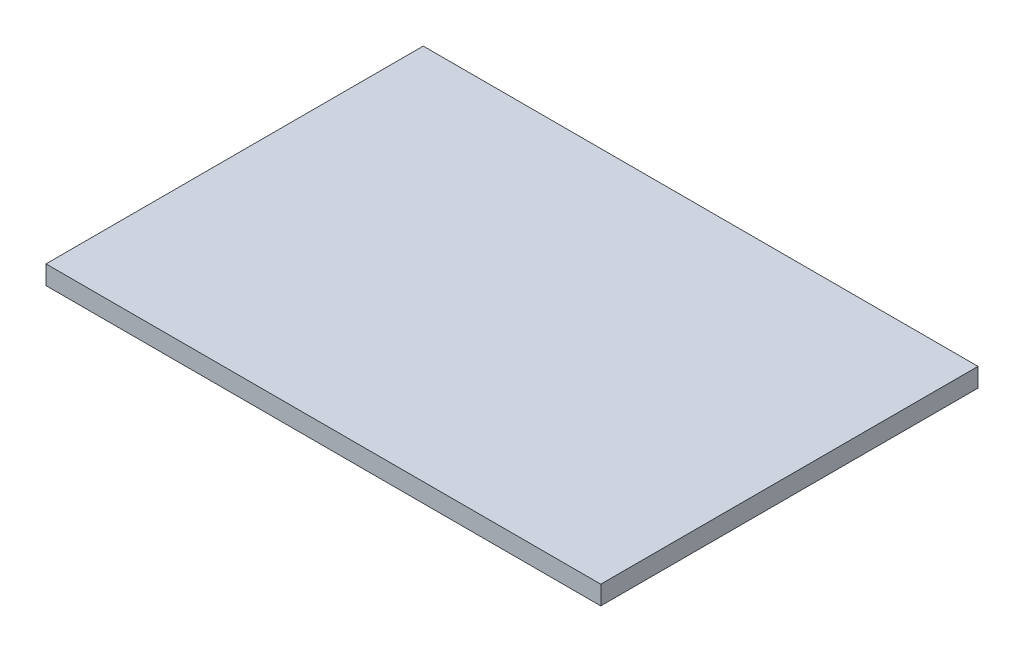
ISO-10303-21;
HEADER;
FILE_DESCRIPTION(('STEP AP214'),'2;1');
FILE_NAME('part.step','',(''),(''),'','','');
FILE_SCHEMA(('AUTOMOTIVE_DESIGN { 1 0 10303 214 1 1 1 1 }'));
ENDSEC;
DATA;
#1=APPLICATION_CONTEXT('core data for automotive mechanical design processes');
#2=APPLICATION_PROTOCOL_DEFINITION('international standard','automotive_design',2000,#1);
#3=PRODUCT_CONTEXT('',#1,'mechanical');
#4=PRODUCT('Part','Part','',(#3));
#5=PRODUCT_RELATED_PRODUCT_CATEGORY('part','',(#4));
#6=PRODUCT_DEFINITION_FORMATION('','',#4);
#7=PRODUCT_DEFINITION_CONTEXT('part definition',#1,'design');
#8=PRODUCT_DEFINITION('design','',#6,#7);
#9=PRODUCT_DEFINITION_SHAPE('','',#8);
#10=(LENGTH_UNIT() NAMED_UNIT(*) SI_UNIT(.MILLI.,.METRE.));
#11=(NAMED_UNIT(*) PLANE_ANGLE_UNIT() SI_UNIT($,.RADIAN.));
#12=(NAMED_UNIT(*) SI_UNIT($,.STERADIAN.) SOLID_ANGLE_UNIT());
#13=UNCERTAINTY_MEASURE_WITH_UNIT(LENGTH_MEASURE(1.E-05),#10,'distance_accuracy_value','');
#14=(GEOMETRIC_REPRESENTATION_CONTEXT(3) GLOBAL_UNCERTAINTY_ASSIGNED_CONTEXT((#13)) GLOBAL_UNIT_ASSIGNED_CONTEXT((#10,
#11,#12)) REPRESENTATION_CONTEXT('',''));
#15=CARTESIAN_POINT('',(0.,0.,0.));
#16=DIRECTION('',(0.,0.,1.));
#17=DIRECTION('',(1.,0.,0.));
#18=AXIS2_PLACEMENT_3D('',#15,#16,#17);
#19=CARTESIAN_POINT('',(21.6,-2.2,-14.5));
#20=DIRECTION('',(-1.,0.,0.));
#21=DIRECTION('',(0.,0.,1.));
#22=AXIS2_PLACEMENT_3D('',#19,#20,#21);
#23=PLANE('',#22);
#24=DIRECTION('',(0.,0.,1.));
#25=VECTOR('',#24,1.);
#26=CARTESIAN_POINT('',(21.6,0.,-14.5));
#27=LINE('',#26,#25);
#28=CARTESIAN_POINT('',(21.6,0.,-14.5));
#29=VERTEX_POINT('',#28);
#30=CARTESIAN_POINT('',(21.6,0.,-0.5));
#31=VERTEX_POINT('',#30);
#32=EDGE_CURVE('E106',#29,#31,#27,.T.);
#33=ORIENTED_EDGE('',*,*,#32,.T.);
#34=DIRECTION('',(0.,1.,0.));
#35=VECTOR('',#34,1.);
#36=CARTESIAN_POINT('',(21.6,-2.2,-0.5));
#37=LINE('',#36,#35);
#38=CARTESIAN_POINT('',(21.6,-2.2,-0.5));
#39=VERTEX_POINT('',#38);
#40=EDGE_CURVE('E12',#39,#31,#37,.T.);
#41=ORIENTED_EDGE('',*,*,#40,.F.);
#42=DIRECTION('',(0.,0.,1.));
#43=VECTOR('',#42,1.);
#44=CARTESIAN_POINT('',(21.6,-2.2,-14.5));
#45=LINE('',#44,#43);
#46=CARTESIAN_POINT('',(21.6,-2.2,-14.5));
#47=VERTEX_POINT('',#46);
#48=EDGE_CURVE('E94',#47,#39,#45,.T.);
#49=ORIENTED_EDGE('',*,*,#48,.F.);
#50=DIRECTION('',(0.,1.,0.));
#51=VECTOR('',#50,1.);
#52=CARTESIAN_POINT('',(21.6,-2.2,-14.5));
#53=LINE('',#52,#51);
#54=EDGE_CURVE('E102',#47,#29,#53,.T.);
#55=ORIENTED_EDGE('',*,*,#54,.T.);
#56=EDGE_LOOP('',(#33,#41,#49,#55));
#57=FACE_BOUND('',#56,.T.);
#58=ADVANCED_FACE('F43',(#57),#23,.F.);
#59=CARTESIAN_POINT('',(21.6,-2.2,-0.5));
#60=DIRECTION('',(0.,0.,-1.));
#61=DIRECTION('',(-1.,0.,0.));
#62=AXIS2_PLACEMENT_3D('',#59,#60,#61);
#63=PLANE('',#62);
#64=DIRECTION('',(-1.,0.,0.));
#65=VECTOR('',#64,1.);
#66=CARTESIAN_POINT('',(21.6,0.,-0.5));
#67=LINE('',#66,#65);
#68=CARTESIAN_POINT('',(7.9,0.,-0.500000000000001));
#69=VERTEX_POINT('',#68);
#70=EDGE_CURVE('E98',#31,#69,#67,.T.);
#71=ORIENTED_EDGE('',*,*,#70,.T.);
#72=DIRECTION('',(0.,1.,0.));
#73=VECTOR('',#72,1.);
#74=CARTESIAN_POINT('',(7.9,-2.2,-0.500000000000001));
#75=LINE('',#74,#73);
#76=CARTESIAN_POINT('',(7.9,-2.2,-0.500000000000001));
#77=VERTEX_POINT('',#76);
#78=EDGE_CURVE('E51',#77,#69,#75,.T.);
#79=ORIENTED_EDGE('',*,*,#78,.F.);
#80=DIRECTION('',(-1.,0.,0.));
#81=VECTOR('',#80,1.);
#82=CARTESIAN_POINT('',(21.6,-2.2,-0.5));
#83=LINE('',#82,#81);
#84=EDGE_CURVE('E89',#39,#77,#83,.T.);
#85=ORIENTED_EDGE('',*,*,#84,.F.);
#86=ORIENTED_EDGE('',*,*,#40,.T.);
#87=EDGE_LOOP('',(#71,#79,#85,#86));
#88=FACE_BOUND('',#87,.T.);
#89=ADVANCED_FACE('F97',(#88),#63,.F.);
#90=CARTESIAN_POINT('',(7.9,-2.2,-14.5));
#91=DIRECTION('',(1.,0.,0.));
#92=DIRECTION('',(0.,0.,-1.));
#93=AXIS2_PLACEMENT_3D('',#90,#91,#92);
#94=PLANE('',#93);
#95=DIRECTION('',(0.,0.,-1.));
#96=VECTOR('',#95,1.);
#97=CARTESIAN_POINT('',(7.9,0.,-14.5));
#98=LINE('',#97,#96);
#99=CARTESIAN_POINT('',(7.9,0.,-14.5));
#100=VERTEX_POINT('',#99);
#101=EDGE_CURVE('E76',#69,#100,#98,.T.);
#102=ORIENTED_EDGE('',*,*,#101,.T.);
#103=DIRECTION('',(0.,1.,0.));
#104=VECTOR('',#103,1.);
#105=CARTESIAN_POINT('',(7.9,-2.2,-14.5));
#106=LINE('',#105,#104);
#107=CARTESIAN_POINT('',(7.9,-2.2,-14.5));
#108=VERTEX_POINT('',#107);
#109=EDGE_CURVE('E99',#108,#100,#106,.T.);
#110=ORIENTED_EDGE('',*,*,#109,.F.);
#111=DIRECTION('',(0.,0.,-1.));
#112=VECTOR('',#111,1.);
#113=CARTESIAN_POINT('',(7.9,-2.2,-14.5));
#114=LINE('',#113,#112);
#115=EDGE_CURVE('E92',#77,#108,#114,.T.);
#116=ORIENTED_EDGE('',*,*,#115,.F.);
#117=ORIENTED_EDGE('',*,*,#78,.T.);
#118=EDGE_LOOP('',(#102,#110,#116,#117));
#119=FACE_BOUND('',#118,.T.);
#120=ADVANCED_FACE('F100',(#119),#94,.F.);
#121=CARTESIAN_POINT('',(21.6,-2.2,-14.5));
#122=DIRECTION('',(0.,0.,1.));
#123=DIRECTION('',(1.,0.,0.));
#124=AXIS2_PLACEMENT_3D('',#121,#122,#123);
#125=PLANE('',#124);
#126=DIRECTION('',(1.,0.,0.));
#127=VECTOR('',#126,1.);
#128=CARTESIAN_POINT('',(21.6,0.,-14.5));
#129=LINE('',#128,#127);
#130=EDGE_CURVE('E82',#100,#29,#129,.T.);
#131=ORIENTED_EDGE('',*,*,#130,.T.);
#132=ORIENTED_EDGE('',*,*,#54,.F.);
#133=DIRECTION('',(1.,0.,0.));
#134=VECTOR('',#133,1.);
#135=CARTESIAN_POINT('',(21.6,-2.2,-14.5));
#136=LINE('',#135,#134);
#137=EDGE_CURVE('E59',#108,#47,#136,.T.);
#138=ORIENTED_EDGE('',*,*,#137,.F.);
#139=ORIENTED_EDGE('',*,*,#109,.T.);
#140=EDGE_LOOP('',(#131,#132,#138,#139));
#141=FACE_BOUND('',#140,.T.);
#142=ADVANCED_FACE('F113',(#141),#125,.F.);
#143=CARTESIAN_POINT('',(0.,-2.2,0.));
#144=DIRECTION('',(0.,-1.,0.));
#145=DIRECTION('',(0.,0.,-1.));
#146=AXIS2_PLACEMENT_3D('',#143,#144,#145);
#147=PLANE('',#146);
#148=ORIENTED_EDGE('',*,*,#48,.T.);
#149=ORIENTED_EDGE('',*,*,#84,.T.);
#150=ORIENTED_EDGE('',*,*,#115,.T.);
#151=ORIENTED_EDGE('',*,*,#137,.T.);
#152=EDGE_LOOP('',(#148,#149,#150,#151));
#153=FACE_BOUND('',#152,.T.);
#154=ADVANCED_FACE('F90',(#153),#147,.T.);
#155=CARTESIAN_POINT('',(0.,0.,0.));
#156=DIRECTION('',(0.,-1.,0.));
#157=DIRECTION('',(0.,0.,-1.));
#158=AXIS2_PLACEMENT_3D('',#155,#156,#157);
#159=PLANE('',#158);
#160=ORIENTED_EDGE('',*,*,#32,.F.);
#161=ORIENTED_EDGE('',*,*,#130,.F.);
#162=ORIENTED_EDGE('',*,*,#101,.F.);
#163=ORIENTED_EDGE('',*,*,#70,.F.);
#164=EDGE_LOOP('',(#160,#161,#162,#163));
#165=FACE_BOUND('',#164,.T.);
#166=ADVANCED_FACE('F116',(#165),#159,.F.);
#167=CLOSED_SHELL('',(#58,#89,#120,#142,#154,#166));
#168=MANIFOLD_SOLID_BREP('B2',#167);
#169=CARTESIAN_POINT('',(25.,1.7,-17.));
#170=DIRECTION('',(-1.,0.,0.));
#171=DIRECTION('',(0.,0.,1.));
#172=AXIS2_PLACEMENT_3D('',#169,#170,#171);
#173=PLANE('',#172);
#174=DIRECTION('',(0.,0.,-1.));
#175=VECTOR('',#174,1.);
#176=CARTESIAN_POINT('',(25.,0.,-17.));
#177=LINE('',#176,#175);
#178=CARTESIAN_POINT('',(25.,0.,17.));
#179=VERTEX_POINT('',#178);
#180=CARTESIAN_POINT('',(25.,0.,-17.));
#181=VERTEX_POINT('',#180);
#182=EDGE_CURVE('E229',#179,#181,#177,.T.);
#183=ORIENTED_EDGE('',*,*,#182,.T.);
#184=DIRECTION('',(0.,-1.,0.));
#185=VECTOR('',#184,1.);
#186=CARTESIAN_POINT('',(25.,1.7,-17.));
#187=LINE('',#186,#185);
#188=CARTESIAN_POINT('',(25.,1.7,-17.));
#189=VERTEX_POINT('',#188);
#190=EDGE_CURVE('E41',#189,#181,#187,.T.);
#191=ORIENTED_EDGE('',*,*,#190,.F.);
#192=DIRECTION('',(0.,0.,-1.));
#193=VECTOR('',#192,1.);
#194=CARTESIAN_POINT('',(25.,1.7,-17.));
#195=LINE('',#194,#193);
#196=CARTESIAN_POINT('',(25.,1.7,17.));
#197=VERTEX_POINT('',#196);
#198=EDGE_CURVE('E217',#197,#189,#195,.T.);
#199=ORIENTED_EDGE('',*,*,#198,.F.);
#200=DIRECTION('',(0.,-1.,0.));
#201=VECTOR('',#200,1.);
#202=CARTESIAN_POINT('',(25.,1.7,17.));
#203=LINE('',#202,#201);
#204=EDGE_CURVE('E225',#197,#179,#203,.T.);
#205=ORIENTED_EDGE('',*,*,#204,.T.);
#206=EDGE_LOOP('',(#183,#191,#199,#205));
#207=FACE_BOUND('',#206,.T.);
#208=ADVANCED_FACE('F166',(#207),#173,.F.);
#209=CARTESIAN_POINT('',(-25.,1.7,-17.));
#210=DIRECTION('',(0.,0.,1.));
#211=DIRECTION('',(1.,0.,0.));
#212=AXIS2_PLACEMENT_3D('',#209,#210,#211);
#213=PLANE('',#212);
#214=DIRECTION('',(-1.,0.,0.));
#215=VECTOR('',#214,1.);
#216=CARTESIAN_POINT('',(-25.,0.,-17.));
#217=LINE('',#216,#215);
#218=CARTESIAN_POINT('',(-25.,0.,-17.));
#219=VERTEX_POINT('',#218);
#220=EDGE_CURVE('E221',#181,#219,#217,.T.);
#221=ORIENTED_EDGE('',*,*,#220,.T.);
#222=DIRECTION('',(0.,-1.,0.));
#223=VECTOR('',#222,1.);
#224=CARTESIAN_POINT('',(-25.,1.7,-17.));
#225=LINE('',#224,#223);
#226=CARTESIAN_POINT('',(-25.,1.7,-17.));
#227=VERTEX_POINT('',#226);
#228=EDGE_CURVE('E174',#227,#219,#225,.T.);
#229=ORIENTED_EDGE('',*,*,#228,.F.);
#230=DIRECTION('',(-1.,0.,0.));
#231=VECTOR('',#230,1.);
#232=CARTESIAN_POINT('',(-25.,1.7,-17.));
#233=LINE('',#232,#231);
#234=EDGE_CURVE('E212',#189,#227,#233,.T.);
#235=ORIENTED_EDGE('',*,*,#234,.F.);
#236=ORIENTED_EDGE('',*,*,#190,.T.);
#237=EDGE_LOOP('',(#221,#229,#235,#236));
#238=FACE_BOUND('',#237,.T.);
#239=ADVANCED_FACE('F220',(#238),#213,.F.);
#240=CARTESIAN_POINT('',(-25.,1.7,-17.));
#241=DIRECTION('',(1.,0.,0.));
#242=DIRECTION('',(0.,0.,-1.));
#243=AXIS2_PLACEMENT_3D('',#240,#241,#242);
#244=PLANE('',#243);
#245=DIRECTION('',(0.,0.,1.));
#246=VECTOR('',#245,1.);
#247=CARTESIAN_POINT('',(-25.,0.,-17.));
#248=LINE('',#247,#246);
#249=CARTESIAN_POINT('',(-25.,0.,17.));
#250=VERTEX_POINT('',#249);
#251=EDGE_CURVE('E199',#219,#250,#248,.T.);
#252=ORIENTED_EDGE('',*,*,#251,.T.);
#253=DIRECTION('',(0.,-1.,0.));
#254=VECTOR('',#253,1.);
#255=CARTESIAN_POINT('',(-25.,1.7,17.));
#256=LINE('',#255,#254);
#257=CARTESIAN_POINT('',(-25.,1.7,17.));
#258=VERTEX_POINT('',#257);
#259=EDGE_CURVE('E222',#258,#250,#256,.T.);
#260=ORIENTED_EDGE('',*,*,#259,.F.);
#261=DIRECTION('',(0.,0.,1.));
#262=VECTOR('',#261,1.);
#263=CARTESIAN_POINT('',(-25.,1.7,-17.));
#264=LINE('',#263,#262);
#265=EDGE_CURVE('E215',#227,#258,#264,.T.);
#266=ORIENTED_EDGE('',*,*,#265,.F.);
#267=ORIENTED_EDGE('',*,*,#228,.T.);
#268=EDGE_LOOP('',(#252,#260,#266,#267));
#269=FACE_BOUND('',#268,.T.);
#270=ADVANCED_FACE('F223',(#269),#244,.F.);
#271=CARTESIAN_POINT('',(-25.,1.7,17.));
#272=DIRECTION('',(0.,0.,-1.));
#273=DIRECTION('',(-1.,0.,0.));
#274=AXIS2_PLACEMENT_3D('',#271,#272,#273);
#275=PLANE('',#274);
#276=DIRECTION('',(1.,0.,0.));
#277=VECTOR('',#276,1.);
#278=CARTESIAN_POINT('',(-25.,0.,17.));
#279=LINE('',#278,#277);
#280=EDGE_CURVE('E205',#250,#179,#279,.T.);
#281=ORIENTED_EDGE('',*,*,#280,.T.);
#282=ORIENTED_EDGE('',*,*,#204,.F.);
#283=DIRECTION('',(1.,0.,0.));
#284=VECTOR('',#283,1.);
#285=CARTESIAN_POINT('',(-25.,1.7,17.));
#286=LINE('',#285,#284);
#287=EDGE_CURVE('E182',#258,#197,#286,.T.);
#288=ORIENTED_EDGE('',*,*,#287,.F.);
#289=ORIENTED_EDGE('',*,*,#259,.T.);
#290=EDGE_LOOP('',(#281,#282,#288,#289));
#291=FACE_BOUND('',#290,.T.);
#292=ADVANCED_FACE('F236',(#291),#275,.F.);
#293=CARTESIAN_POINT('',(0.,1.7,0.));
#294=DIRECTION('',(0.,1.,0.));
#295=DIRECTION('',(0.,0.,1.));
#296=AXIS2_PLACEMENT_3D('',#293,#294,#295);
#297=PLANE('',#296);
#298=ORIENTED_EDGE('',*,*,#198,.T.);
#299=ORIENTED_EDGE('',*,*,#234,.T.);
#300=ORIENTED_EDGE('',*,*,#265,.T.);
#301=ORIENTED_EDGE('',*,*,#287,.T.);
#302=EDGE_LOOP('',(#298,#299,#300,#301));
#303=FACE_BOUND('',#302,.T.);
#304=ADVANCED_FACE('F213',(#303),#297,.T.);
#305=CARTESIAN_POINT('',(0.,0.,0.));
#306=DIRECTION('',(0.,1.,0.));
#307=DIRECTION('',(0.,0.,1.));
#308=AXIS2_PLACEMENT_3D('',#305,#306,#307);
#309=PLANE('',#308);
#310=ORIENTED_EDGE('',*,*,#182,.F.);
#311=ORIENTED_EDGE('',*,*,#280,.F.);
#312=ORIENTED_EDGE('',*,*,#251,.F.);
#313=ORIENTED_EDGE('',*,*,#220,.F.);
#314=EDGE_LOOP('',(#310,#311,#312,#313));
#315=FACE_BOUND('',#314,.T.);
#316=ADVANCED_FACE('F239',(#315),#309,.F.);
#317=CLOSED_SHELL('',(#208,#239,#270,#292,#304,#316));
#318=MANIFOLD_SOLID_BREP('B6',#317);
#319=ADVANCED_BREP_SHAPE_REPRESENTATION('',(#18,#168,#318),#14);
#320=SHAPE_DEFINITION_REPRESENTATION(#9,#319);
ENDSEC;
END-ISO-10303-21;
